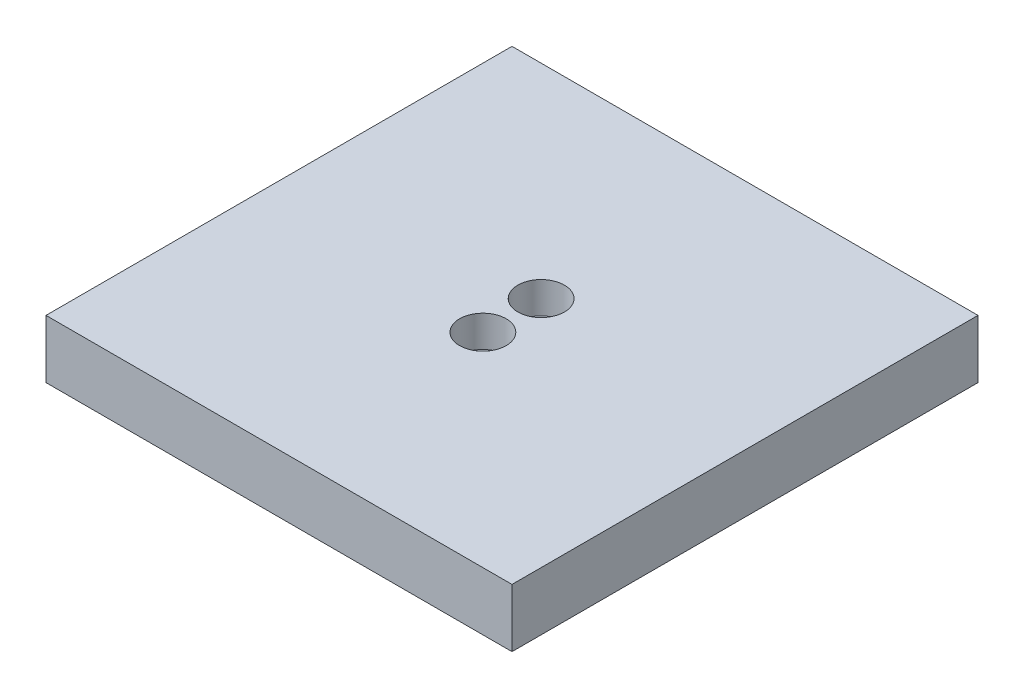
ISO-10303-21;
HEADER;
FILE_DESCRIPTION(('STEP AP214'),'2;1');
FILE_NAME('part.step','',(''),(''),'','','');
FILE_SCHEMA(('AUTOMOTIVE_DESIGN { 1 0 10303 214 1 1 1 1 }'));
ENDSEC;
DATA;
#1=APPLICATION_CONTEXT('core data for automotive mechanical design processes');
#2=APPLICATION_PROTOCOL_DEFINITION('international standard','automotive_design',2000,#1);
#3=PRODUCT_CONTEXT('',#1,'mechanical');
#4=PRODUCT('Part','Part','',(#3));
#5=PRODUCT_RELATED_PRODUCT_CATEGORY('part','',(#4));
#6=PRODUCT_DEFINITION_FORMATION('','',#4);
#7=PRODUCT_DEFINITION_CONTEXT('part definition',#1,'design');
#8=PRODUCT_DEFINITION('design','',#6,#7);
#9=PRODUCT_DEFINITION_SHAPE('','',#8);
#10=(LENGTH_UNIT() NAMED_UNIT(*) SI_UNIT(.MILLI.,.METRE.));
#11=(NAMED_UNIT(*) PLANE_ANGLE_UNIT() SI_UNIT($,.RADIAN.));
#12=(NAMED_UNIT(*) SI_UNIT($,.STERADIAN.) SOLID_ANGLE_UNIT());
#13=UNCERTAINTY_MEASURE_WITH_UNIT(LENGTH_MEASURE(1.E-05),#10,'distance_accuracy_value','');
#14=(GEOMETRIC_REPRESENTATION_CONTEXT(3) GLOBAL_UNCERTAINTY_ASSIGNED_CONTEXT((#13)) GLOBAL_UNIT_ASSIGNED_CONTEXT((#10,
#11,#12)) REPRESENTATION_CONTEXT('',''));
#15=CARTESIAN_POINT('',(0.,0.,0.));
#16=DIRECTION('',(0.,0.,1.));
#17=DIRECTION('',(1.,0.,0.));
#18=AXIS2_PLACEMENT_3D('',#15,#16,#17);
#19=CARTESIAN_POINT('',(20.,0.,22.5));
#20=DIRECTION('',(0.,1.,0.));
#21=DIRECTION('',(0.,0.,1.));
#22=AXIS2_PLACEMENT_3D('',#19,#20,#21);
#23=CYLINDRICAL_SURFACE('',#22,1.2);
#24=CARTESIAN_POINT('',(20.,0.,22.5));
#25=DIRECTION('',(0.,1.,0.));
#26=DIRECTION('',(0.,0.,1.));
#27=AXIS2_PLACEMENT_3D('',#24,#25,#26);
#28=CIRCLE('',#27,1.2);
#29=CARTESIAN_POINT('',(20.,0.,23.7));
#30=VERTEX_POINT('',#29);
#31=EDGE_CURVE('E122',#30,#30,#28,.T.);
#32=ORIENTED_EDGE('',*,*,#31,.F.);
#33=EDGE_LOOP('',(#32));
#34=FACE_BOUND('',#33,.T.);
#35=CARTESIAN_POINT('',(20.,2.3,22.5));
#36=DIRECTION('',(0.,1.,0.));
#37=DIRECTION('',(0.,0.,1.));
#38=AXIS2_PLACEMENT_3D('',#35,#36,#37);
#39=CIRCLE('',#38,1.2);
#40=CARTESIAN_POINT('',(20.,2.3,23.7));
#41=VERTEX_POINT('',#40);
#42=EDGE_CURVE('E45',#41,#41,#39,.F.);
#43=ORIENTED_EDGE('',*,*,#42,.F.);
#44=EDGE_LOOP('',(#43));
#45=FACE_BOUND('',#44,.T.);
#46=ADVANCED_FACE('F41',(#34,#45),#23,.F.);
#47=CARTESIAN_POINT('',(20.,0.,17.5));
#48=DIRECTION('',(0.,1.,0.));
#49=DIRECTION('',(0.,0.,1.));
#50=AXIS2_PLACEMENT_3D('',#47,#48,#49);
#51=CYLINDRICAL_SURFACE('',#50,1.2);
#52=CARTESIAN_POINT('',(20.,0.,17.5));
#53=DIRECTION('',(0.,1.,0.));
#54=DIRECTION('',(0.,0.,1.));
#55=AXIS2_PLACEMENT_3D('',#52,#53,#54);
#56=CIRCLE('',#55,1.2);
#57=CARTESIAN_POINT('',(20.,0.,18.7));
#58=VERTEX_POINT('',#57);
#59=EDGE_CURVE('E111',#58,#58,#56,.T.);
#60=ORIENTED_EDGE('',*,*,#59,.F.);
#61=EDGE_LOOP('',(#60));
#62=FACE_BOUND('',#61,.T.);
#63=CARTESIAN_POINT('',(20.,2.3,17.5));
#64=DIRECTION('',(0.,1.,0.));
#65=DIRECTION('',(0.,0.,1.));
#66=AXIS2_PLACEMENT_3D('',#63,#64,#65);
#67=CIRCLE('',#66,1.2);
#68=CARTESIAN_POINT('',(20.,2.3,18.7));
#69=VERTEX_POINT('',#68);
#70=EDGE_CURVE('E116',#69,#69,#67,.F.);
#71=ORIENTED_EDGE('',*,*,#70,.F.);
#72=EDGE_LOOP('',(#71));
#73=FACE_BOUND('',#72,.T.);
#74=ADVANCED_FACE('F147',(#62,#73),#51,.F.);
#75=CARTESIAN_POINT('',(0.,5.,0.));
#76=DIRECTION('',(1.,0.,0.));
#77=DIRECTION('',(0.,0.,-1.));
#78=AXIS2_PLACEMENT_3D('',#75,#76,#77);
#79=PLANE('',#78);
#80=DIRECTION('',(0.,0.,1.));
#81=VECTOR('',#80,1.);
#82=CARTESIAN_POINT('',(0.,0.,0.));
#83=LINE('',#82,#81);
#84=CARTESIAN_POINT('',(0.,0.,0.));
#85=VERTEX_POINT('',#84);
#86=CARTESIAN_POINT('',(0.,0.,40.));
#87=VERTEX_POINT('',#86);
#88=EDGE_CURVE('E108',#85,#87,#83,.T.);
#89=ORIENTED_EDGE('',*,*,#88,.T.);
#90=DIRECTION('',(0.,-1.,0.));
#91=VECTOR('',#90,1.);
#92=CARTESIAN_POINT('',(0.,5.,40.));
#93=LINE('',#92,#91);
#94=CARTESIAN_POINT('',(0.,5.,40.));
#95=VERTEX_POINT('',#94);
#96=EDGE_CURVE('E11',#95,#87,#93,.T.);
#97=ORIENTED_EDGE('',*,*,#96,.F.);
#98=DIRECTION('',(0.,0.,1.));
#99=VECTOR('',#98,1.);
#100=CARTESIAN_POINT('',(0.,5.,0.));
#101=LINE('',#100,#99);
#102=CARTESIAN_POINT('',(0.,5.,0.));
#103=VERTEX_POINT('',#102);
#104=EDGE_CURVE('E95',#103,#95,#101,.T.);
#105=ORIENTED_EDGE('',*,*,#104,.F.);
#106=DIRECTION('',(0.,-1.,0.));
#107=VECTOR('',#106,1.);
#108=CARTESIAN_POINT('',(0.,5.,0.));
#109=LINE('',#108,#107);
#110=EDGE_CURVE('E104',#103,#85,#109,.T.);
#111=ORIENTED_EDGE('',*,*,#110,.T.);
#112=EDGE_LOOP('',(#89,#97,#105,#111));
#113=FACE_BOUND('',#112,.T.);
#114=ADVANCED_FACE('F43',(#113),#79,.F.);
#115=CARTESIAN_POINT('',(0.,5.,40.));
#116=DIRECTION('',(0.,0.,-1.));
#117=DIRECTION('',(-1.,0.,0.));
#118=AXIS2_PLACEMENT_3D('',#115,#116,#117);
#119=PLANE('',#118);
#120=DIRECTION('',(1.,0.,0.));
#121=VECTOR('',#120,1.);
#122=CARTESIAN_POINT('',(0.,0.,40.));
#123=LINE('',#122,#121);
#124=CARTESIAN_POINT('',(40.,0.,40.));
#125=VERTEX_POINT('',#124);
#126=EDGE_CURVE('E99',#87,#125,#123,.T.);
#127=ORIENTED_EDGE('',*,*,#126,.T.);
#128=DIRECTION('',(0.,-1.,0.));
#129=VECTOR('',#128,1.);
#130=CARTESIAN_POINT('',(40.,5.,40.));
#131=LINE('',#130,#129);
#132=CARTESIAN_POINT('',(40.,5.,40.));
#133=VERTEX_POINT('',#132);
#134=EDGE_CURVE('E51',#133,#125,#131,.T.);
#135=ORIENTED_EDGE('',*,*,#134,.F.);
#136=DIRECTION('',(1.,0.,0.));
#137=VECTOR('',#136,1.);
#138=CARTESIAN_POINT('',(0.,5.,40.));
#139=LINE('',#138,#137);
#140=EDGE_CURVE('E90',#95,#133,#139,.T.);
#141=ORIENTED_EDGE('',*,*,#140,.F.);
#142=ORIENTED_EDGE('',*,*,#96,.T.);
#143=EDGE_LOOP('',(#127,#135,#141,#142));
#144=FACE_BOUND('',#143,.T.);
#145=ADVANCED_FACE('F98',(#144),#119,.F.);
#146=CARTESIAN_POINT('',(40.,5.,0.));
#147=DIRECTION('',(-1.,0.,0.));
#148=DIRECTION('',(0.,0.,1.));
#149=AXIS2_PLACEMENT_3D('',#146,#147,#148);
#150=PLANE('',#149);
#151=DIRECTION('',(0.,0.,-1.));
#152=VECTOR('',#151,1.);
#153=CARTESIAN_POINT('',(40.,0.,0.));
#154=LINE('',#153,#152);
#155=CARTESIAN_POINT('',(40.,0.,0.));
#156=VERTEX_POINT('',#155);
#157=EDGE_CURVE('E77',#125,#156,#154,.T.);
#158=ORIENTED_EDGE('',*,*,#157,.T.);
#159=DIRECTION('',(0.,-1.,0.));
#160=VECTOR('',#159,1.);
#161=CARTESIAN_POINT('',(40.,5.,0.));
#162=LINE('',#161,#160);
#163=CARTESIAN_POINT('',(40.,5.,0.));
#164=VERTEX_POINT('',#163);
#165=EDGE_CURVE('E100',#164,#156,#162,.T.);
#166=ORIENTED_EDGE('',*,*,#165,.F.);
#167=DIRECTION('',(0.,0.,-1.));
#168=VECTOR('',#167,1.);
#169=CARTESIAN_POINT('',(40.,5.,0.));
#170=LINE('',#169,#168);
#171=EDGE_CURVE('E93',#133,#164,#170,.T.);
#172=ORIENTED_EDGE('',*,*,#171,.F.);
#173=ORIENTED_EDGE('',*,*,#134,.T.);
#174=EDGE_LOOP('',(#158,#166,#172,#173));
#175=FACE_BOUND('',#174,.T.);
#176=ADVANCED_FACE('F102',(#175),#150,.F.);
#177=CARTESIAN_POINT('',(0.,5.,0.));
#178=DIRECTION('',(0.,0.,1.));
#179=DIRECTION('',(1.,0.,0.));
#180=AXIS2_PLACEMENT_3D('',#177,#178,#179);
#181=PLANE('',#180);
#182=DIRECTION('',(-1.,0.,0.));
#183=VECTOR('',#182,1.);
#184=CARTESIAN_POINT('',(0.,0.,0.));
#185=LINE('',#184,#183);
#186=EDGE_CURVE('E83',#156,#85,#185,.T.);
#187=ORIENTED_EDGE('',*,*,#186,.T.);
#188=ORIENTED_EDGE('',*,*,#110,.F.);
#189=DIRECTION('',(-1.,0.,0.));
#190=VECTOR('',#189,1.);
#191=CARTESIAN_POINT('',(0.,5.,0.));
#192=LINE('',#191,#190);
#193=EDGE_CURVE('E60',#164,#103,#192,.T.);
#194=ORIENTED_EDGE('',*,*,#193,.F.);
#195=ORIENTED_EDGE('',*,*,#165,.T.);
#196=EDGE_LOOP('',(#187,#188,#194,#195));
#197=FACE_BOUND('',#196,.T.);
#198=ADVANCED_FACE('F172',(#197),#181,.F.);
#199=CARTESIAN_POINT('',(0.,5.,0.));
#200=DIRECTION('',(0.,1.,0.));
#201=DIRECTION('',(0.,0.,1.));
#202=AXIS2_PLACEMENT_3D('',#199,#200,#201);
#203=PLANE('',#202);
#204=CARTESIAN_POINT('',(20.,5.,17.5));
#205=DIRECTION('',(0.,1.,0.));
#206=DIRECTION('',(0.,0.,1.));
#207=AXIS2_PLACEMENT_3D('',#204,#205,#206);
#208=CIRCLE('',#207,2.);
#209=CARTESIAN_POINT('',(20.,5.,19.5));
#210=VERTEX_POINT('',#209);
#211=EDGE_CURVE('E124',#210,#210,#208,.T.);
#212=ORIENTED_EDGE('',*,*,#211,.F.);
#213=EDGE_LOOP('',(#212));
#214=FACE_BOUND('',#213,.T.);
#215=CARTESIAN_POINT('',(20.,5.,22.5));
#216=DIRECTION('',(0.,1.,0.));
#217=DIRECTION('',(0.,0.,1.));
#218=AXIS2_PLACEMENT_3D('',#215,#216,#217);
#219=CIRCLE('',#218,2.);
#220=CARTESIAN_POINT('',(20.,5.,24.5));
#221=VERTEX_POINT('',#220);
#222=EDGE_CURVE('E129',#221,#221,#219,.T.);
#223=ORIENTED_EDGE('',*,*,#222,.F.);
#224=EDGE_LOOP('',(#223));
#225=FACE_BOUND('',#224,.T.);
#226=ORIENTED_EDGE('',*,*,#104,.T.);
#227=ORIENTED_EDGE('',*,*,#140,.T.);
#228=ORIENTED_EDGE('',*,*,#171,.T.);
#229=ORIENTED_EDGE('',*,*,#193,.T.);
#230=EDGE_LOOP('',(#226,#227,#228,#229));
#231=FACE_BOUND('',#230,.T.);
#232=ADVANCED_FACE('F91',(#214,#225,#231),#203,.T.);
#233=CARTESIAN_POINT('',(0.,0.,0.));
#234=DIRECTION('',(0.,1.,0.));
#235=DIRECTION('',(0.,0.,1.));
#236=AXIS2_PLACEMENT_3D('',#233,#234,#235);
#237=PLANE('',#236);
#238=ORIENTED_EDGE('',*,*,#59,.T.);
#239=EDGE_LOOP('',(#238));
#240=FACE_BOUND('',#239,.T.);
#241=ORIENTED_EDGE('',*,*,#31,.T.);
#242=EDGE_LOOP('',(#241));
#243=FACE_BOUND('',#242,.T.);
#244=ORIENTED_EDGE('',*,*,#88,.F.);
#245=ORIENTED_EDGE('',*,*,#186,.F.);
#246=ORIENTED_EDGE('',*,*,#157,.F.);
#247=ORIENTED_EDGE('',*,*,#126,.F.);
#248=EDGE_LOOP('',(#244,#245,#246,#247));
#249=FACE_BOUND('',#248,.T.);
#250=ADVANCED_FACE('F142',(#240,#243,#249),#237,.F.);
#251=CARTESIAN_POINT('',(20.,2.3,17.5));
#252=DIRECTION('',(0.,1.,0.));
#253=DIRECTION('',(0.,0.,1.));
#254=AXIS2_PLACEMENT_3D('',#251,#252,#253);
#255=PLANE('',#254);
#256=CARTESIAN_POINT('',(20.,2.3,17.5));
#257=DIRECTION('',(0.,1.,0.));
#258=DIRECTION('',(0.,0.,1.));
#259=AXIS2_PLACEMENT_3D('',#256,#257,#258);
#260=CIRCLE('',#259,2.);
#261=CARTESIAN_POINT('',(20.,2.3,19.5));
#262=VERTEX_POINT('',#261);
#263=EDGE_CURVE('E118',#262,#262,#260,.T.);
#264=ORIENTED_EDGE('',*,*,#263,.T.);
#265=EDGE_LOOP('',(#264));
#266=FACE_BOUND('',#265,.T.);
#267=ORIENTED_EDGE('',*,*,#70,.T.);
#268=EDGE_LOOP('',(#267));
#269=FACE_BOUND('',#268,.T.);
#270=ADVANCED_FACE('F163',(#266,#269),#255,.T.);
#271=CARTESIAN_POINT('',(20.,2.3,17.5));
#272=DIRECTION('',(0.,1.,0.));
#273=DIRECTION('',(0.,0.,1.));
#274=AXIS2_PLACEMENT_3D('',#271,#272,#273);
#275=CYLINDRICAL_SURFACE('',#274,2.);
#276=CARTESIAN_POINT('',(20.,2.3,19.5));
#277=CARTESIAN_POINT('',(20.,2.328125,19.5));
#278=CARTESIAN_POINT('',(20.,2.35625,19.5));
#279=CARTESIAN_POINT('',(20.,2.4125,19.5));
#280=CARTESIAN_POINT('',(20.,2.440625,19.5));
#281=CARTESIAN_POINT('',(20.,2.496875,19.5));
#282=CARTESIAN_POINT('',(20.,2.525,19.5));
#283=CARTESIAN_POINT('',(20.,2.58125,19.5));
#284=CARTESIAN_POINT('',(20.,2.609375,19.5));
#285=CARTESIAN_POINT('',(20.,2.665625,19.5));
#286=CARTESIAN_POINT('',(20.,2.69375,19.5));
#287=CARTESIAN_POINT('',(20.,2.75,19.5));
#288=CARTESIAN_POINT('',(20.,2.778125,19.5));
#289=CARTESIAN_POINT('',(20.,2.834375,19.5));
#290=CARTESIAN_POINT('',(20.,2.8625,19.5));
#291=CARTESIAN_POINT('',(20.,2.91875,19.5));
#292=CARTESIAN_POINT('',(20.,2.946875,19.5));
#293=CARTESIAN_POINT('',(20.,3.003125,19.5));
#294=CARTESIAN_POINT('',(20.,3.03125,19.5));
#295=CARTESIAN_POINT('',(20.,3.0875,19.5));
#296=CARTESIAN_POINT('',(20.,3.115625,19.5));
#297=CARTESIAN_POINT('',(20.,3.171875,19.5));
#298=CARTESIAN_POINT('',(20.,3.2,19.5));
#299=CARTESIAN_POINT('',(20.,3.25625,19.5));
#300=CARTESIAN_POINT('',(20.,3.284375,19.5));
#301=CARTESIAN_POINT('',(20.,3.340625,19.5));
#302=CARTESIAN_POINT('',(20.,3.36875,19.5));
#303=CARTESIAN_POINT('',(20.,3.425,19.5));
#304=CARTESIAN_POINT('',(20.,3.453125,19.5));
#305=CARTESIAN_POINT('',(20.,3.509375,19.5));
#306=CARTESIAN_POINT('',(20.,3.5375,19.5));
#307=CARTESIAN_POINT('',(20.,3.59375,19.5));
#308=CARTESIAN_POINT('',(20.,3.621875,19.5));
#309=CARTESIAN_POINT('',(20.,3.678125,19.5));
#310=CARTESIAN_POINT('',(20.,3.70625,19.5));
#311=CARTESIAN_POINT('',(20.,3.7625,19.5));
#312=CARTESIAN_POINT('',(20.,3.790625,19.5));
#313=CARTESIAN_POINT('',(20.,3.846875,19.5));
#314=CARTESIAN_POINT('',(20.,3.875,19.5));
#315=CARTESIAN_POINT('',(20.,3.93125,19.5));
#316=CARTESIAN_POINT('',(20.,3.959375,19.5));
#317=CARTESIAN_POINT('',(20.,4.015625,19.5));
#318=CARTESIAN_POINT('',(20.,4.04375,19.5));
#319=CARTESIAN_POINT('',(20.,4.1,19.5));
#320=CARTESIAN_POINT('',(20.,4.128125,19.5));
#321=CARTESIAN_POINT('',(20.,4.184375,19.5));
#322=CARTESIAN_POINT('',(20.,4.2125,19.5));
#323=CARTESIAN_POINT('',(20.,4.26875,19.5));
#324=CARTESIAN_POINT('',(20.,4.296875,19.5));
#325=CARTESIAN_POINT('',(20.,4.353125,19.5));
#326=CARTESIAN_POINT('',(20.,4.38125,19.5));
#327=CARTESIAN_POINT('',(20.,4.4375,19.5));
#328=CARTESIAN_POINT('',(20.,4.465625,19.5));
#329=CARTESIAN_POINT('',(20.,4.521875,19.5));
#330=CARTESIAN_POINT('',(20.,4.55,19.5));
#331=CARTESIAN_POINT('',(20.,4.60625,19.5));
#332=CARTESIAN_POINT('',(20.,4.634375,19.5));
#333=CARTESIAN_POINT('',(20.,4.690625,19.5));
#334=CARTESIAN_POINT('',(20.,4.71875,19.5));
#335=CARTESIAN_POINT('',(20.,4.775,19.5));
#336=CARTESIAN_POINT('',(20.,4.803125,19.5));
#337=CARTESIAN_POINT('',(20.,4.859375,19.5));
#338=CARTESIAN_POINT('',(20.,4.8875,19.5));
#339=CARTESIAN_POINT('',(20.,4.94375,19.5));
#340=CARTESIAN_POINT('',(20.,4.971875,19.5));
#341=CARTESIAN_POINT('',(20.,5.,19.5));
#342=B_SPLINE_CURVE_WITH_KNOTS('',3,(#276,#277,#278,#279,#280,#281,#282,#283,#284,#285,#286,
#287,#288,#289,#290,#291,#292,#293,#294,#295,#296,#297,#298,#299,#300,#301,#302,#303,#304,#305,
#306,#307,#308,#309,#310,#311,#312,#313,#314,#315,#316,#317,#318,#319,#320,#321,#322,#323,#324,
#325,#326,#327,#328,#329,#330,#331,#332,#333,#334,#335,#336,#337,#338,#339,#340,#341),
.UNSPECIFIED.,.F.,.F.,(4,2,2,2,2,2,2,2,2,2,2,2,2,2,2,2,2,2,2,2,2,2,2,2,2,2,2,2,2,2,2,2,4),(0.,
0.0843750000000003,0.16875,0.253125,0.3375,0.421875,0.50625,0.590625,0.675,0.759375,0.84375,
0.928125000000001,1.0125,1.096875,1.18125,1.265625,1.35,1.434375,1.51875,1.603125,1.6875,
1.771875,1.85625,1.940625,2.025,2.109375,2.19375,2.278125,2.3625,2.446875,2.53125,2.615625,2.7),.UNSPECIFIED.);
#343=EDGE_CURVE('BSEAM154',#262,#210,#342,.T.);
#344=ORIENTED_EDGE('',*,*,#263,.F.);
#345=ORIENTED_EDGE('',*,*,#211,.T.);
#346=ORIENTED_EDGE('',*,*,#343,.T.);
#347=ORIENTED_EDGE('',*,*,#343,.F.);
#348=EDGE_LOOP('',(#344,#346,#345,#347));
#349=FACE_BOUND('',#348,.T.);
#350=ADVANCED_FACE('F154',(#349),#275,.F.);
#351=CARTESIAN_POINT('',(20.,2.3,22.5));
#352=DIRECTION('',(0.,1.,0.));
#353=DIRECTION('',(0.,0.,1.));
#354=AXIS2_PLACEMENT_3D('',#351,#352,#353);
#355=PLANE('',#354);
#356=CARTESIAN_POINT('',(20.,2.3,22.5));
#357=DIRECTION('',(0.,1.,0.));
#358=DIRECTION('',(0.,0.,1.));
#359=AXIS2_PLACEMENT_3D('',#356,#357,#358);
#360=CIRCLE('',#359,2.);
#361=CARTESIAN_POINT('',(20.,2.3,24.5));
#362=VERTEX_POINT('',#361);
#363=EDGE_CURVE('E134',#362,#362,#360,.T.);
#364=ORIENTED_EDGE('',*,*,#363,.T.);
#365=EDGE_LOOP('',(#364));
#366=FACE_BOUND('',#365,.T.);
#367=ORIENTED_EDGE('',*,*,#42,.T.);
#368=EDGE_LOOP('',(#367));
#369=FACE_BOUND('',#368,.T.);
#370=ADVANCED_FACE('F151',(#366,#369),#355,.T.);
#371=CARTESIAN_POINT('',(20.,2.3,22.5));
#372=DIRECTION('',(0.,1.,0.));
#373=DIRECTION('',(0.,0.,1.));
#374=AXIS2_PLACEMENT_3D('',#371,#372,#373);
#375=CYLINDRICAL_SURFACE('',#374,2.);
#376=CARTESIAN_POINT('',(20.,2.3,24.5));
#377=CARTESIAN_POINT('',(20.,2.328125,24.5));
#378=CARTESIAN_POINT('',(20.,2.35625,24.5));
#379=CARTESIAN_POINT('',(20.,2.4125,24.5));
#380=CARTESIAN_POINT('',(20.,2.440625,24.5));
#381=CARTESIAN_POINT('',(20.,2.496875,24.5));
#382=CARTESIAN_POINT('',(20.,2.525,24.5));
#383=CARTESIAN_POINT('',(20.,2.58125,24.5));
#384=CARTESIAN_POINT('',(20.,2.609375,24.5));
#385=CARTESIAN_POINT('',(20.,2.665625,24.5));
#386=CARTESIAN_POINT('',(20.,2.69375,24.5));
#387=CARTESIAN_POINT('',(20.,2.75,24.5));
#388=CARTESIAN_POINT('',(20.,2.778125,24.5));
#389=CARTESIAN_POINT('',(20.,2.834375,24.5));
#390=CARTESIAN_POINT('',(20.,2.8625,24.5));
#391=CARTESIAN_POINT('',(20.,2.91875,24.5));
#392=CARTESIAN_POINT('',(20.,2.946875,24.5));
#393=CARTESIAN_POINT('',(20.,3.003125,24.5));
#394=CARTESIAN_POINT('',(20.,3.03125,24.5));
#395=CARTESIAN_POINT('',(20.,3.0875,24.5));
#396=CARTESIAN_POINT('',(20.,3.115625,24.5));
#397=CARTESIAN_POINT('',(20.,3.171875,24.5));
#398=CARTESIAN_POINT('',(20.,3.2,24.5));
#399=CARTESIAN_POINT('',(20.,3.25625,24.5));
#400=CARTESIAN_POINT('',(20.,3.284375,24.5));
#401=CARTESIAN_POINT('',(20.,3.340625,24.5));
#402=CARTESIAN_POINT('',(20.,3.36875,24.5));
#403=CARTESIAN_POINT('',(20.,3.425,24.5));
#404=CARTESIAN_POINT('',(20.,3.453125,24.5));
#405=CARTESIAN_POINT('',(20.,3.509375,24.5));
#406=CARTESIAN_POINT('',(20.,3.5375,24.5));
#407=CARTESIAN_POINT('',(20.,3.59375,24.5));
#408=CARTESIAN_POINT('',(20.,3.621875,24.5));
#409=CARTESIAN_POINT('',(20.,3.678125,24.5));
#410=CARTESIAN_POINT('',(20.,3.70625,24.5));
#411=CARTESIAN_POINT('',(20.,3.7625,24.5));
#412=CARTESIAN_POINT('',(20.,3.790625,24.5));
#413=CARTESIAN_POINT('',(20.,3.846875,24.5));
#414=CARTESIAN_POINT('',(20.,3.875,24.5));
#415=CARTESIAN_POINT('',(20.,3.93125,24.5));
#416=CARTESIAN_POINT('',(20.,3.959375,24.5));
#417=CARTESIAN_POINT('',(20.,4.015625,24.5));
#418=CARTESIAN_POINT('',(20.,4.04375,24.5));
#419=CARTESIAN_POINT('',(20.,4.1,24.5));
#420=CARTESIAN_POINT('',(20.,4.128125,24.5));
#421=CARTESIAN_POINT('',(20.,4.184375,24.5));
#422=CARTESIAN_POINT('',(20.,4.2125,24.5));
#423=CARTESIAN_POINT('',(20.,4.26875,24.5));
#424=CARTESIAN_POINT('',(20.,4.296875,24.5));
#425=CARTESIAN_POINT('',(20.,4.353125,24.5));
#426=CARTESIAN_POINT('',(20.,4.38125,24.5));
#427=CARTESIAN_POINT('',(20.,4.4375,24.5));
#428=CARTESIAN_POINT('',(20.,4.465625,24.5));
#429=CARTESIAN_POINT('',(20.,4.521875,24.5));
#430=CARTESIAN_POINT('',(20.,4.55,24.5));
#431=CARTESIAN_POINT('',(20.,4.60625,24.5));
#432=CARTESIAN_POINT('',(20.,4.634375,24.5));
#433=CARTESIAN_POINT('',(20.,4.690625,24.5));
#434=CARTESIAN_POINT('',(20.,4.71875,24.5));
#435=CARTESIAN_POINT('',(20.,4.775,24.5));
#436=CARTESIAN_POINT('',(20.,4.803125,24.5));
#437=CARTESIAN_POINT('',(20.,4.859375,24.5));
#438=CARTESIAN_POINT('',(20.,4.8875,24.5));
#439=CARTESIAN_POINT('',(20.,4.94375,24.5));
#440=CARTESIAN_POINT('',(20.,4.971875,24.5));
#441=CARTESIAN_POINT('',(20.,5.,24.5));
#442=B_SPLINE_CURVE_WITH_KNOTS('',3,(#376,#377,#378,#379,#380,#381,#382,#383,#384,#385,#386,
#387,#388,#389,#390,#391,#392,#393,#394,#395,#396,#397,#398,#399,#400,#401,#402,#403,#404,#405,
#406,#407,#408,#409,#410,#411,#412,#413,#414,#415,#416,#417,#418,#419,#420,#421,#422,#423,#424,
#425,#426,#427,#428,#429,#430,#431,#432,#433,#434,#435,#436,#437,#438,#439,#440,#441),
.UNSPECIFIED.,.F.,.F.,(4,2,2,2,2,2,2,2,2,2,2,2,2,2,2,2,2,2,2,2,2,2,2,2,2,2,2,2,2,2,2,2,4),(0.,
0.0843750000000003,0.16875,0.253125,0.3375,0.421875,0.50625,0.590625,0.675,0.759375,0.84375,
0.928125000000001,1.0125,1.096875,1.18125,1.265625,1.35,1.434375,1.51875,1.603125,1.6875,
1.771875,1.85625,1.940625,2.025,2.109375,2.19375,2.278125,2.3625,2.446875,2.53125,2.615625,2.7),.UNSPECIFIED.);
#443=EDGE_CURVE('BSEAM153',#362,#221,#442,.T.);
#444=ORIENTED_EDGE('',*,*,#363,.F.);
#445=ORIENTED_EDGE('',*,*,#222,.T.);
#446=ORIENTED_EDGE('',*,*,#443,.T.);
#447=ORIENTED_EDGE('',*,*,#443,.F.);
#448=EDGE_LOOP('',(#444,#446,#445,#447));
#449=FACE_BOUND('',#448,.T.);
#450=ADVANCED_FACE('F153',(#449),#375,.F.);
#451=CLOSED_SHELL('',(#46,#74,#114,#145,#176,#198,#232,#250,#270,#350,#370,#450));
#452=MANIFOLD_SOLID_BREP('B2',#451);
#453=ADVANCED_BREP_SHAPE_REPRESENTATION('',(#18,#452),#14);
#454=SHAPE_DEFINITION_REPRESENTATION(#9,#453);
ENDSEC;
END-ISO-10303-21;
